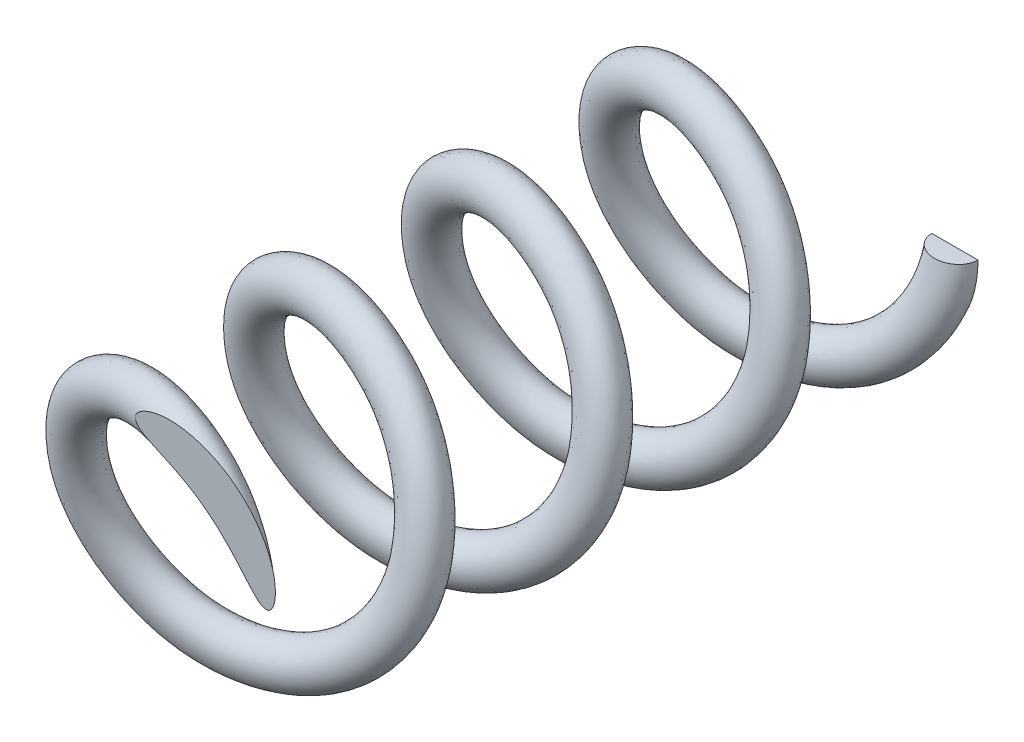
ISO-10303-21;
HEADER;
FILE_DESCRIPTION(('STEP AP214'),'2;1');
FILE_NAME('part.step','',(''),(''),'','','');
FILE_SCHEMA(('AUTOMOTIVE_DESIGN { 1 0 10303 214 1 1 1 1 }'));
ENDSEC;
DATA;
#1=APPLICATION_CONTEXT('core data for automotive mechanical design processes');
#2=APPLICATION_PROTOCOL_DEFINITION('international standard','automotive_design',2000,#1);
#3=PRODUCT_CONTEXT('',#1,'mechanical');
#4=PRODUCT('Part','Part','',(#3));
#5=PRODUCT_RELATED_PRODUCT_CATEGORY('part','',(#4));
#6=PRODUCT_DEFINITION_FORMATION('','',#4);
#7=PRODUCT_DEFINITION_CONTEXT('part definition',#1,'design');
#8=PRODUCT_DEFINITION('design','',#6,#7);
#9=PRODUCT_DEFINITION_SHAPE('','',#8);
#10=(LENGTH_UNIT() NAMED_UNIT(*) SI_UNIT(.MILLI.,.METRE.));
#11=(NAMED_UNIT(*) PLANE_ANGLE_UNIT() SI_UNIT($,.RADIAN.));
#12=(NAMED_UNIT(*) SI_UNIT($,.STERADIAN.) SOLID_ANGLE_UNIT());
#13=UNCERTAINTY_MEASURE_WITH_UNIT(LENGTH_MEASURE(1.E-05),#10,'distance_accuracy_value','');
#14=(GEOMETRIC_REPRESENTATION_CONTEXT(3) GLOBAL_UNCERTAINTY_ASSIGNED_CONTEXT((#13)) GLOBAL_UNIT_ASSIGNED_CONTEXT((#10,
#11,#12)) REPRESENTATION_CONTEXT('',''));
#15=CARTESIAN_POINT('',(0.,0.,0.));
#16=DIRECTION('',(0.,0.,1.));
#17=DIRECTION('',(1.,0.,0.));
#18=AXIS2_PLACEMENT_3D('',#15,#16,#17);
#19=CARTESIAN_POINT('',(2.2,0.,0.814326105627249));
#20=DIRECTION('',(0.,1.,0.));
#21=DIRECTION('',(0.,0.,1.));
#22=AXIS2_PLACEMENT_3D('',#19,#20,#21);
#23=PLANE('',#22);
#24=DIRECTION('',(1.,0.,0.));
#25=VECTOR('',#24,1.);
#26=CARTESIAN_POINT('',(2.2,0.,0.814326105627249));
#27=LINE('',#26,#25);
#28=CARTESIAN_POINT('',(1.8,0.,0.814326105627249));
#29=VERTEX_POINT('',#28);
#30=CARTESIAN_POINT('',(2.6,0.,0.814326105627249));
#31=VERTEX_POINT('',#30);
#32=EDGE_CURVE('E54',#29,#31,#27,.T.);
#33=ORIENTED_EDGE('',*,*,#32,.F.);
#34=CARTESIAN_POINT('',(1.8,0.,0.814326105627249));
#35=CARTESIAN_POINT('',(1.8,0.,1.02052293167192));
#36=CARTESIAN_POINT('',(1.96568542494924,0.,1.16632610562725));
#37=CARTESIAN_POINT('',(2.2,0.,1.16632610562725));
#38=(BOUNDED_CURVE() B_SPLINE_CURVE(3,(#34,#35,#36,#37),.UNSPECIFIED.,.F.,
.F.) B_SPLINE_CURVE_WITH_KNOTS((4,4),(0.,1.),
.UNSPECIFIED.) CURVE() GEOMETRIC_REPRESENTATION_ITEM() RATIONAL_B_SPLINE_CURVE((1.,
0.804737854124365,0.804737854124365,1.)) REPRESENTATION_ITEM(''));
#39=CARTESIAN_POINT('',(2.2,0.,1.16632610562725));
#40=VERTEX_POINT('',#39);
#41=EDGE_CURVE('E59',#29,#40,#38,.T.);
#42=ORIENTED_EDGE('',*,*,#41,.T.);
#43=CARTESIAN_POINT('',(2.2,0.,1.16632610562725));
#44=CARTESIAN_POINT('',(2.43431457505076,0.,1.16632610562725));
#45=CARTESIAN_POINT('',(2.6,0.,1.02052293167192));
#46=CARTESIAN_POINT('',(2.6,0.,0.814326105627249));
#47=(BOUNDED_CURVE() B_SPLINE_CURVE(3,(#43,#44,#45,#46),.UNSPECIFIED.,.F.,
.F.) B_SPLINE_CURVE_WITH_KNOTS((4,4),(0.,1.),
.UNSPECIFIED.) CURVE() GEOMETRIC_REPRESENTATION_ITEM() RATIONAL_B_SPLINE_CURVE((1.,
0.804737854124365,0.804737854124365,1.)) REPRESENTATION_ITEM(''));
#48=EDGE_CURVE('E47',#40,#31,#47,.T.);
#49=ORIENTED_EDGE('',*,*,#48,.T.);
#50=EDGE_LOOP('',(#33,#42,#49));
#51=FACE_BOUND('',#50,.T.);
#52=ADVANCED_FACE('F34',(#51),#23,.T.);
#53=CARTESIAN_POINT('',(2.2,0.,1.16632610562725));
#54=CARTESIAN_POINT('',(2.2,-1.27017059221718,1.42299277229391));
#55=CARTESIAN_POINT('',(1.1,-1.90525588832576,1.67965943896058));
#56=CARTESIAN_POINT('',(0.,-2.54034118443435,1.93632610562725));
#57=CARTESIAN_POINT('',(-1.1,-1.90525588832577,2.19299277229391));
#58=CARTESIAN_POINT('',(-2.2,-1.27017059221718,2.44965943896058));
#59=CARTESIAN_POINT('',(-2.2,0.,2.70632610562725));
#60=CARTESIAN_POINT('',(-2.2,1.27017059221718,2.96299277229391));
#61=CARTESIAN_POINT('',(-1.1,1.90525588832576,3.21965943896058));
#62=CARTESIAN_POINT('',(0.,2.54034118443435,3.47632610562724));
#63=CARTESIAN_POINT('',(1.1,1.90525588832577,3.73299277229391));
#64=CARTESIAN_POINT('',(2.2,1.27017059221718,3.98965943896058));
#65=CARTESIAN_POINT('',(2.2,0.,4.24632610562724));
#66=CARTESIAN_POINT('',(2.2,-1.27017059221718,4.50299277229391));
#67=CARTESIAN_POINT('',(1.1,-1.90525588832576,4.75965943896057));
#68=CARTESIAN_POINT('',(0.,-2.54034118443435,5.01632610562724));
#69=CARTESIAN_POINT('',(-1.1,-1.90525588832577,5.27299277229391));
#70=CARTESIAN_POINT('',(-2.2,-1.27017059221718,5.52965943896057));
#71=CARTESIAN_POINT('',(-2.2,0.,5.78632610562724));
#72=CARTESIAN_POINT('',(-2.2,1.27017059221718,6.04299277229391));
#73=CARTESIAN_POINT('',(-1.1,1.90525588832576,6.29965943896057));
#74=CARTESIAN_POINT('',(0.,2.54034118443435,6.55632610562724));
#75=CARTESIAN_POINT('',(1.1,1.90525588832577,6.8129927722939));
#76=CARTESIAN_POINT('',(2.2,1.27017059221718,7.06965943896057));
#77=CARTESIAN_POINT('',(2.2,0.,7.32632610562724));
#78=CARTESIAN_POINT('',(2.2,-1.27017059221718,7.5829927722939));
#79=CARTESIAN_POINT('',(1.1,-1.90525588832576,7.83965943896057));
#80=CARTESIAN_POINT('',(0.,-2.54034118443435,8.09632610562723));
#81=CARTESIAN_POINT('',(-1.1,-1.90525588832577,8.3529927722939));
#82=CARTESIAN_POINT('',(-2.2,-1.27017059221718,8.60965943896057));
#83=CARTESIAN_POINT('',(-2.2,0.,8.86632610562723));
#84=CARTESIAN_POINT('',(-2.2,1.27017059221718,9.1229927722939));
#85=CARTESIAN_POINT('',(-1.1,1.90525588832576,9.37965943896056));
#86=CARTESIAN_POINT('',(0.,2.54034118443435,9.63632610562723));
#87=CARTESIAN_POINT('',(1.1,1.90525588832577,9.8929927722939));
#88=CARTESIAN_POINT('',(2.2,1.27017059221718,10.1496594389606));
#89=CARTESIAN_POINT('',(2.2,0.,10.4063261056272));
#90=CARTESIAN_POINT('',(2.2,-1.27017059221718,10.6629927722939));
#91=CARTESIAN_POINT('',(1.1,-1.90525588832576,10.9196594389606));
#92=CARTESIAN_POINT('',(0.,-2.54034118443435,11.1763261056272));
#93=CARTESIAN_POINT('',(-1.1,-1.90525588832577,11.4329927722939));
#94=CARTESIAN_POINT('',(-2.2,-1.27017059221718,11.6896594389606));
#95=CARTESIAN_POINT('',(-2.2,0.,11.9463261056272));
#96=CARTESIAN_POINT('',(-2.2,1.27017059221718,12.2029927722939));
#97=CARTESIAN_POINT('',(-1.1,1.90525588832576,12.4596594389606));
#98=CARTESIAN_POINT('',(0.,2.54034118443435,12.7163261056272));
#99=CARTESIAN_POINT('',(1.1,1.90525588832577,12.9729927722939));
#100=CARTESIAN_POINT('',(2.2,1.27017059221718,13.2296594389606));
#101=CARTESIAN_POINT('',(2.2,0.,13.4863261056272));
#102=CARTESIAN_POINT('',(3.,0.,1.16632610562725));
#103=CARTESIAN_POINT('',(3.,-1.73205080756888,1.42299277229392));
#104=CARTESIAN_POINT('',(1.5,-2.59807621135332,1.67965943896058));
#105=CARTESIAN_POINT('',(0.,-3.46410161513775,1.93632610562725));
#106=CARTESIAN_POINT('',(-1.5,-2.59807621135332,2.19299277229391));
#107=CARTESIAN_POINT('',(-3.,-1.73205080756888,2.44965943896058));
#108=CARTESIAN_POINT('',(-3.,0.,2.70632610562725));
#109=CARTESIAN_POINT('',(-3.,1.73205080756888,2.96299277229391));
#110=CARTESIAN_POINT('',(-1.5,2.59807621135332,3.21965943896058));
#111=CARTESIAN_POINT('',(0.,3.46410161513775,3.47632610562724));
#112=CARTESIAN_POINT('',(1.5,2.59807621135332,3.73299277229391));
#113=CARTESIAN_POINT('',(3.,1.73205080756888,3.98965943896058));
#114=CARTESIAN_POINT('',(3.,0.,4.24632610562724));
#115=CARTESIAN_POINT('',(3.,-1.73205080756888,4.50299277229391));
#116=CARTESIAN_POINT('',(1.5,-2.59807621135332,4.75965943896057));
#117=CARTESIAN_POINT('',(0.,-3.46410161513775,5.01632610562724));
#118=CARTESIAN_POINT('',(-1.5,-2.59807621135332,5.27299277229391));
#119=CARTESIAN_POINT('',(-3.,-1.73205080756888,5.52965943896057));
#120=CARTESIAN_POINT('',(-3.,0.,5.78632610562724));
#121=CARTESIAN_POINT('',(-3.,1.73205080756888,6.04299277229391));
#122=CARTESIAN_POINT('',(-1.5,2.59807621135332,6.29965943896057));
#123=CARTESIAN_POINT('',(0.,3.46410161513775,6.55632610562724));
#124=CARTESIAN_POINT('',(1.5,2.59807621135332,6.8129927722939));
#125=CARTESIAN_POINT('',(3.,1.73205080756888,7.06965943896057));
#126=CARTESIAN_POINT('',(3.,0.,7.32632610562724));
#127=CARTESIAN_POINT('',(3.,-1.73205080756888,7.5829927722939));
#128=CARTESIAN_POINT('',(1.5,-2.59807621135332,7.83965943896057));
#129=CARTESIAN_POINT('',(0.,-3.46410161513775,8.09632610562723));
#130=CARTESIAN_POINT('',(-1.5,-2.59807621135332,8.3529927722939));
#131=CARTESIAN_POINT('',(-3.,-1.73205080756888,8.60965943896057));
#132=CARTESIAN_POINT('',(-3.,0.,8.86632610562723));
#133=CARTESIAN_POINT('',(-3.,1.73205080756888,9.1229927722939));
#134=CARTESIAN_POINT('',(-1.5,2.59807621135332,9.37965943896056));
#135=CARTESIAN_POINT('',(0.,3.46410161513775,9.63632610562723));
#136=CARTESIAN_POINT('',(1.5,2.59807621135332,9.8929927722939));
#137=CARTESIAN_POINT('',(3.,1.73205080756888,10.1496594389606));
#138=CARTESIAN_POINT('',(3.,0.,10.4063261056272));
#139=CARTESIAN_POINT('',(3.,-1.73205080756888,10.6629927722939));
#140=CARTESIAN_POINT('',(1.5,-2.59807621135332,10.9196594389606));
#141=CARTESIAN_POINT('',(0.,-3.46410161513775,11.1763261056272));
#142=CARTESIAN_POINT('',(-1.5,-2.59807621135332,11.4329927722939));
#143=CARTESIAN_POINT('',(-3.,-1.73205080756888,11.6896594389606));
#144=CARTESIAN_POINT('',(-3.,0.,11.9463261056272));
#145=CARTESIAN_POINT('',(-3.,1.73205080756888,12.2029927722939));
#146=CARTESIAN_POINT('',(-1.5,2.59807621135332,12.4596594389606));
#147=CARTESIAN_POINT('',(0.,3.46410161513775,12.7163261056272));
#148=CARTESIAN_POINT('',(1.5,2.59807621135332,12.9729927722939));
#149=CARTESIAN_POINT('',(3.,1.73205080756888,13.2296594389606));
#150=CARTESIAN_POINT('',(3.,0.,13.4863261056272));
#151=CARTESIAN_POINT('',(3.,0.,0.462326105627249));
#152=CARTESIAN_POINT('',(3.,-1.73205080756888,0.718992772293915));
#153=CARTESIAN_POINT('',(1.5,-2.59807621135332,0.975659438960581));
#154=CARTESIAN_POINT('',(0.,-3.46410161513775,1.23232610562725));
#155=CARTESIAN_POINT('',(-1.5,-2.59807621135332,1.48899277229391));
#156=CARTESIAN_POINT('',(-3.,-1.73205080756888,1.74565943896058));
#157=CARTESIAN_POINT('',(-3.,0.,2.00232610562725));
#158=CARTESIAN_POINT('',(-3.,1.73205080756888,2.25899277229391));
#159=CARTESIAN_POINT('',(-1.5,2.59807621135332,2.51565943896058));
#160=CARTESIAN_POINT('',(0.,3.46410161513775,2.77232610562724));
#161=CARTESIAN_POINT('',(1.5,2.59807621135332,3.02899277229391));
#162=CARTESIAN_POINT('',(3.,1.73205080756888,3.28565943896058));
#163=CARTESIAN_POINT('',(3.,0.,3.54232610562724));
#164=CARTESIAN_POINT('',(3.,-1.73205080756888,3.79899277229391));
#165=CARTESIAN_POINT('',(1.5,-2.59807621135332,4.05565943896057));
#166=CARTESIAN_POINT('',(0.,-3.46410161513775,4.31232610562724));
#167=CARTESIAN_POINT('',(-1.5,-2.59807621135332,4.56899277229391));
#168=CARTESIAN_POINT('',(-3.,-1.73205080756888,4.82565943896057));
#169=CARTESIAN_POINT('',(-3.,0.,5.08232610562724));
#170=CARTESIAN_POINT('',(-3.,1.73205080756888,5.33899277229391));
#171=CARTESIAN_POINT('',(-1.5,2.59807621135332,5.59565943896057));
#172=CARTESIAN_POINT('',(0.,3.46410161513775,5.85232610562724));
#173=CARTESIAN_POINT('',(1.5,2.59807621135332,6.1089927722939));
#174=CARTESIAN_POINT('',(3.,1.73205080756888,6.36565943896057));
#175=CARTESIAN_POINT('',(3.,0.,6.62232610562724));
#176=CARTESIAN_POINT('',(3.,-1.73205080756888,6.8789927722939));
#177=CARTESIAN_POINT('',(1.5,-2.59807621135332,7.13565943896057));
#178=CARTESIAN_POINT('',(0.,-3.46410161513775,7.39232610562723));
#179=CARTESIAN_POINT('',(-1.5,-2.59807621135332,7.6489927722939));
#180=CARTESIAN_POINT('',(-3.,-1.73205080756888,7.90565943896057));
#181=CARTESIAN_POINT('',(-3.,0.,8.16232610562723));
#182=CARTESIAN_POINT('',(-3.,1.73205080756888,8.4189927722939));
#183=CARTESIAN_POINT('',(-1.5,2.59807621135332,8.67565943896056));
#184=CARTESIAN_POINT('',(0.,3.46410161513775,8.93232610562723));
#185=CARTESIAN_POINT('',(1.5,2.59807621135332,9.1889927722939));
#186=CARTESIAN_POINT('',(3.,1.73205080756888,9.44565943896056));
#187=CARTESIAN_POINT('',(3.,0.,9.70232610562723));
#188=CARTESIAN_POINT('',(3.,-1.73205080756888,9.95899277229389));
#189=CARTESIAN_POINT('',(1.5,-2.59807621135332,10.2156594389606));
#190=CARTESIAN_POINT('',(0.,-3.46410161513775,10.4723261056272));
#191=CARTESIAN_POINT('',(-1.5,-2.59807621135332,10.7289927722939));
#192=CARTESIAN_POINT('',(-3.,-1.73205080756888,10.9856594389606));
#193=CARTESIAN_POINT('',(-3.,0.,11.2423261056272));
#194=CARTESIAN_POINT('',(-3.,1.73205080756888,11.4989927722939));
#195=CARTESIAN_POINT('',(-1.5,2.59807621135332,11.7556594389606));
#196=CARTESIAN_POINT('',(0.,3.46410161513775,12.0123261056272));
#197=CARTESIAN_POINT('',(1.5,2.59807621135332,12.2689927722939));
#198=CARTESIAN_POINT('',(3.,1.73205080756888,12.5256594389606));
#199=CARTESIAN_POINT('',(3.,0.,12.7823261056272));
#200=CARTESIAN_POINT('',(2.2,0.,0.462326105627249));
#201=CARTESIAN_POINT('',(2.2,-1.27017059221718,0.718992772293915));
#202=CARTESIAN_POINT('',(1.1,-1.90525588832576,0.975659438960581));
#203=CARTESIAN_POINT('',(0.,-2.54034118443435,1.23232610562725));
#204=CARTESIAN_POINT('',(-1.1,-1.90525588832577,1.48899277229391));
#205=CARTESIAN_POINT('',(-2.2,-1.27017059221718,1.74565943896058));
#206=CARTESIAN_POINT('',(-2.2,0.,2.00232610562725));
#207=CARTESIAN_POINT('',(-2.2,1.27017059221718,2.25899277229391));
#208=CARTESIAN_POINT('',(-1.1,1.90525588832576,2.51565943896058));
#209=CARTESIAN_POINT('',(0.,2.54034118443435,2.77232610562724));
#210=CARTESIAN_POINT('',(1.1,1.90525588832577,3.02899277229391));
#211=CARTESIAN_POINT('',(2.2,1.27017059221718,3.28565943896058));
#212=CARTESIAN_POINT('',(2.2,0.,3.54232610562724));
#213=CARTESIAN_POINT('',(2.2,-1.27017059221718,3.79899277229391));
#214=CARTESIAN_POINT('',(1.1,-1.90525588832576,4.05565943896057));
#215=CARTESIAN_POINT('',(0.,-2.54034118443435,4.31232610562724));
#216=CARTESIAN_POINT('',(-1.1,-1.90525588832577,4.56899277229391));
#217=CARTESIAN_POINT('',(-2.2,-1.27017059221718,4.82565943896057));
#218=CARTESIAN_POINT('',(-2.2,0.,5.08232610562724));
#219=CARTESIAN_POINT('',(-2.2,1.27017059221718,5.33899277229391));
#220=CARTESIAN_POINT('',(-1.1,1.90525588832576,5.59565943896057));
#221=CARTESIAN_POINT('',(0.,2.54034118443435,5.85232610562724));
#222=CARTESIAN_POINT('',(1.1,1.90525588832577,6.1089927722939));
#223=CARTESIAN_POINT('',(2.2,1.27017059221718,6.36565943896057));
#224=CARTESIAN_POINT('',(2.2,0.,6.62232610562724));
#225=CARTESIAN_POINT('',(2.2,-1.27017059221718,6.8789927722939));
#226=CARTESIAN_POINT('',(1.1,-1.90525588832576,7.13565943896057));
#227=CARTESIAN_POINT('',(0.,-2.54034118443435,7.39232610562723));
#228=CARTESIAN_POINT('',(-1.1,-1.90525588832577,7.6489927722939));
#229=CARTESIAN_POINT('',(-2.2,-1.27017059221718,7.90565943896057));
#230=CARTESIAN_POINT('',(-2.2,0.,8.16232610562723));
#231=CARTESIAN_POINT('',(-2.2,1.27017059221718,8.4189927722939));
#232=CARTESIAN_POINT('',(-1.1,1.90525588832576,8.67565943896057));
#233=CARTESIAN_POINT('',(0.,2.54034118443435,8.93232610562723));
#234=CARTESIAN_POINT('',(1.1,1.90525588832577,9.1889927722939));
#235=CARTESIAN_POINT('',(2.2,1.27017059221718,9.44565943896056));
#236=CARTESIAN_POINT('',(2.2,0.,9.70232610562723));
#237=CARTESIAN_POINT('',(2.2,-1.27017059221718,9.95899277229389));
#238=CARTESIAN_POINT('',(1.1,-1.90525588832576,10.2156594389606));
#239=CARTESIAN_POINT('',(0.,-2.54034118443435,10.4723261056272));
#240=CARTESIAN_POINT('',(-1.1,-1.90525588832577,10.7289927722939));
#241=CARTESIAN_POINT('',(-2.2,-1.27017059221718,10.9856594389606));
#242=CARTESIAN_POINT('',(-2.2,0.,11.2423261056272));
#243=CARTESIAN_POINT('',(-2.2,1.27017059221718,11.4989927722939));
#244=CARTESIAN_POINT('',(-1.1,1.90525588832576,11.7556594389606));
#245=CARTESIAN_POINT('',(0.,2.54034118443435,12.0123261056272));
#246=CARTESIAN_POINT('',(1.1,1.90525588832577,12.2689927722939));
#247=CARTESIAN_POINT('',(2.2,1.27017059221718,12.5256594389606));
#248=CARTESIAN_POINT('',(2.2,0.,12.7823261056272));
#249=CARTESIAN_POINT('',(1.4,0.,0.462326105627249));
#250=CARTESIAN_POINT('',(1.4,-0.808290376865476,0.718992772293915));
#251=CARTESIAN_POINT('',(0.7,-1.21243556529821,0.975659438960581));
#252=CARTESIAN_POINT('',(0.,-1.61658075373095,1.23232610562725));
#253=CARTESIAN_POINT('',(-0.7,-1.21243556529821,1.48899277229391));
#254=CARTESIAN_POINT('',(-1.4,-0.808290376865477,1.74565943896058));
#255=CARTESIAN_POINT('',(-1.4,0.,2.00232610562725));
#256=CARTESIAN_POINT('',(-1.4,0.808290376865476,2.25899277229391));
#257=CARTESIAN_POINT('',(-0.700000000000001,1.21243556529821,2.51565943896058));
#258=CARTESIAN_POINT('',(0.,1.61658075373095,2.77232610562724));
#259=CARTESIAN_POINT('',(0.699999999999999,1.21243556529821,3.02899277229391));
#260=CARTESIAN_POINT('',(1.4,0.808290376865477,3.28565943896058));
#261=CARTESIAN_POINT('',(1.4,0.,3.54232610562724));
#262=CARTESIAN_POINT('',(1.4,-0.808290376865476,3.79899277229391));
#263=CARTESIAN_POINT('',(0.7,-1.21243556529821,4.05565943896057));
#264=CARTESIAN_POINT('',(0.,-1.61658075373095,4.31232610562724));
#265=CARTESIAN_POINT('',(-0.7,-1.21243556529821,4.56899277229391));
#266=CARTESIAN_POINT('',(-1.4,-0.808290376865477,4.82565943896057));
#267=CARTESIAN_POINT('',(-1.4,0.,5.08232610562724));
#268=CARTESIAN_POINT('',(-1.4,0.808290376865476,5.33899277229391));
#269=CARTESIAN_POINT('',(-0.700000000000001,1.21243556529821,5.59565943896057));
#270=CARTESIAN_POINT('',(0.,1.61658075373095,5.85232610562724));
#271=CARTESIAN_POINT('',(0.699999999999999,1.21243556529821,6.1089927722939));
#272=CARTESIAN_POINT('',(1.4,0.808290376865477,6.36565943896057));
#273=CARTESIAN_POINT('',(1.4,0.,6.62232610562724));
#274=CARTESIAN_POINT('',(1.4,-0.808290376865476,6.8789927722939));
#275=CARTESIAN_POINT('',(0.7,-1.21243556529821,7.13565943896057));
#276=CARTESIAN_POINT('',(0.,-1.61658075373095,7.39232610562723));
#277=CARTESIAN_POINT('',(-0.7,-1.21243556529821,7.6489927722939));
#278=CARTESIAN_POINT('',(-1.4,-0.808290376865477,7.90565943896057));
#279=CARTESIAN_POINT('',(-1.4,0.,8.16232610562723));
#280=CARTESIAN_POINT('',(-1.4,0.808290376865476,8.4189927722939));
#281=CARTESIAN_POINT('',(-0.700000000000001,1.21243556529821,8.67565943896056));
#282=CARTESIAN_POINT('',(0.,1.61658075373095,8.93232610562723));
#283=CARTESIAN_POINT('',(0.699999999999999,1.21243556529821,9.1889927722939));
#284=CARTESIAN_POINT('',(1.4,0.808290376865477,9.44565943896056));
#285=CARTESIAN_POINT('',(1.4,0.,9.70232610562723));
#286=CARTESIAN_POINT('',(1.4,-0.808290376865476,9.95899277229389));
#287=CARTESIAN_POINT('',(0.7,-1.21243556529821,10.2156594389606));
#288=CARTESIAN_POINT('',(0.,-1.61658075373095,10.4723261056272));
#289=CARTESIAN_POINT('',(-0.7,-1.21243556529821,10.7289927722939));
#290=CARTESIAN_POINT('',(-1.4,-0.808290376865477,10.9856594389606));
#291=CARTESIAN_POINT('',(-1.4,0.,11.2423261056272));
#292=CARTESIAN_POINT('',(-1.4,0.808290376865476,11.4989927722939));
#293=CARTESIAN_POINT('',(-0.700000000000001,1.21243556529821,11.7556594389606));
#294=CARTESIAN_POINT('',(0.,1.61658075373095,12.0123261056272));
#295=CARTESIAN_POINT('',(0.699999999999999,1.21243556529821,12.2689927722939));
#296=CARTESIAN_POINT('',(1.4,0.808290376865477,12.5256594389606));
#297=CARTESIAN_POINT('',(1.4,0.,12.7823261056272));
#298=CARTESIAN_POINT('',(1.4,0.,1.16632610562725));
#299=CARTESIAN_POINT('',(1.4,-0.808290376865476,1.42299277229392));
#300=CARTESIAN_POINT('',(0.7,-1.21243556529821,1.67965943896058));
#301=CARTESIAN_POINT('',(0.,-1.61658075373095,1.93632610562725));
#302=CARTESIAN_POINT('',(-0.7,-1.21243556529821,2.19299277229391));
#303=CARTESIAN_POINT('',(-1.4,-0.808290376865477,2.44965943896058));
#304=CARTESIAN_POINT('',(-1.4,0.,2.70632610562725));
#305=CARTESIAN_POINT('',(-1.4,0.808290376865476,2.96299277229391));
#306=CARTESIAN_POINT('',(-0.700000000000001,1.21243556529821,3.21965943896058));
#307=CARTESIAN_POINT('',(0.,1.61658075373095,3.47632610562724));
#308=CARTESIAN_POINT('',(0.699999999999999,1.21243556529821,3.73299277229391));
#309=CARTESIAN_POINT('',(1.4,0.808290376865477,3.98965943896058));
#310=CARTESIAN_POINT('',(1.4,0.,4.24632610562724));
#311=CARTESIAN_POINT('',(1.4,-0.808290376865476,4.50299277229391));
#312=CARTESIAN_POINT('',(0.7,-1.21243556529821,4.75965943896057));
#313=CARTESIAN_POINT('',(0.,-1.61658075373095,5.01632610562724));
#314=CARTESIAN_POINT('',(-0.7,-1.21243556529821,5.27299277229391));
#315=CARTESIAN_POINT('',(-1.4,-0.808290376865477,5.52965943896057));
#316=CARTESIAN_POINT('',(-1.4,0.,5.78632610562724));
#317=CARTESIAN_POINT('',(-1.4,0.808290376865476,6.04299277229391));
#318=CARTESIAN_POINT('',(-0.700000000000001,1.21243556529821,6.29965943896057));
#319=CARTESIAN_POINT('',(0.,1.61658075373095,6.55632610562724));
#320=CARTESIAN_POINT('',(0.699999999999999,1.21243556529821,6.8129927722939));
#321=CARTESIAN_POINT('',(1.4,0.808290376865477,7.06965943896057));
#322=CARTESIAN_POINT('',(1.4,0.,7.32632610562724));
#323=CARTESIAN_POINT('',(1.4,-0.808290376865476,7.5829927722939));
#324=CARTESIAN_POINT('',(0.7,-1.21243556529821,7.83965943896057));
#325=CARTESIAN_POINT('',(0.,-1.61658075373095,8.09632610562723));
#326=CARTESIAN_POINT('',(-0.7,-1.21243556529821,8.3529927722939));
#327=CARTESIAN_POINT('',(-1.4,-0.808290376865477,8.60965943896057));
#328=CARTESIAN_POINT('',(-1.4,0.,8.86632610562723));
#329=CARTESIAN_POINT('',(-1.4,0.808290376865476,9.1229927722939));
#330=CARTESIAN_POINT('',(-0.700000000000001,1.21243556529821,9.37965943896056));
#331=CARTESIAN_POINT('',(0.,1.61658075373095,9.63632610562723));
#332=CARTESIAN_POINT('',(0.699999999999999,1.21243556529821,9.8929927722939));
#333=CARTESIAN_POINT('',(1.4,0.808290376865477,10.1496594389606));
#334=CARTESIAN_POINT('',(1.4,0.,10.4063261056272));
#335=CARTESIAN_POINT('',(1.4,-0.808290376865476,10.6629927722939));
#336=CARTESIAN_POINT('',(0.7,-1.21243556529821,10.9196594389606));
#337=CARTESIAN_POINT('',(0.,-1.61658075373095,11.1763261056272));
#338=CARTESIAN_POINT('',(-0.7,-1.21243556529821,11.4329927722939));
#339=CARTESIAN_POINT('',(-1.4,-0.808290376865477,11.6896594389606));
#340=CARTESIAN_POINT('',(-1.4,0.,11.9463261056272));
#341=CARTESIAN_POINT('',(-1.4,0.808290376865476,12.2029927722939));
#342=CARTESIAN_POINT('',(-0.700000000000001,1.21243556529821,12.4596594389606));
#343=CARTESIAN_POINT('',(0.,1.61658075373095,12.7163261056272));
#344=CARTESIAN_POINT('',(0.699999999999999,1.21243556529821,12.9729927722939));
#345=CARTESIAN_POINT('',(1.4,0.808290376865477,13.2296594389606));
#346=CARTESIAN_POINT('',(1.4,0.,13.4863261056272));
#347=CARTESIAN_POINT('',(2.2,0.,1.16632610562725));
#348=CARTESIAN_POINT('',(2.2,-1.27017059221718,1.42299277229391));
#349=CARTESIAN_POINT('',(1.1,-1.90525588832576,1.67965943896058));
#350=CARTESIAN_POINT('',(0.,-2.54034118443435,1.93632610562725));
#351=CARTESIAN_POINT('',(-1.1,-1.90525588832577,2.19299277229391));
#352=CARTESIAN_POINT('',(-2.2,-1.27017059221718,2.44965943896058));
#353=CARTESIAN_POINT('',(-2.2,0.,2.70632610562725));
#354=CARTESIAN_POINT('',(-2.2,1.27017059221718,2.96299277229391));
#355=CARTESIAN_POINT('',(-1.1,1.90525588832576,3.21965943896058));
#356=CARTESIAN_POINT('',(0.,2.54034118443435,3.47632610562724));
#357=CARTESIAN_POINT('',(1.1,1.90525588832577,3.73299277229391));
#358=CARTESIAN_POINT('',(2.2,1.27017059221718,3.98965943896058));
#359=CARTESIAN_POINT('',(2.2,0.,4.24632610562724));
#360=CARTESIAN_POINT('',(2.2,-1.27017059221718,4.50299277229391));
#361=CARTESIAN_POINT('',(1.1,-1.90525588832576,4.75965943896057));
#362=CARTESIAN_POINT('',(0.,-2.54034118443435,5.01632610562724));
#363=CARTESIAN_POINT('',(-1.1,-1.90525588832577,5.27299277229391));
#364=CARTESIAN_POINT('',(-2.2,-1.27017059221718,5.52965943896057));
#365=CARTESIAN_POINT('',(-2.2,0.,5.78632610562724));
#366=CARTESIAN_POINT('',(-2.2,1.27017059221718,6.04299277229391));
#367=CARTESIAN_POINT('',(-1.1,1.90525588832576,6.29965943896057));
#368=CARTESIAN_POINT('',(0.,2.54034118443435,6.55632610562724));
#369=CARTESIAN_POINT('',(1.1,1.90525588832577,6.8129927722939));
#370=CARTESIAN_POINT('',(2.2,1.27017059221718,7.06965943896057));
#371=CARTESIAN_POINT('',(2.2,0.,7.32632610562724));
#372=CARTESIAN_POINT('',(2.2,-1.27017059221718,7.5829927722939));
#373=CARTESIAN_POINT('',(1.1,-1.90525588832576,7.83965943896057));
#374=CARTESIAN_POINT('',(0.,-2.54034118443435,8.09632610562723));
#375=CARTESIAN_POINT('',(-1.1,-1.90525588832577,8.3529927722939));
#376=CARTESIAN_POINT('',(-2.2,-1.27017059221718,8.60965943896057));
#377=CARTESIAN_POINT('',(-2.2,0.,8.86632610562723));
#378=CARTESIAN_POINT('',(-2.2,1.27017059221718,9.1229927722939));
#379=CARTESIAN_POINT('',(-1.1,1.90525588832576,9.37965943896056));
#380=CARTESIAN_POINT('',(0.,2.54034118443435,9.63632610562723));
#381=CARTESIAN_POINT('',(1.1,1.90525588832577,9.8929927722939));
#382=CARTESIAN_POINT('',(2.2,1.27017059221718,10.1496594389606));
#383=CARTESIAN_POINT('',(2.2,0.,10.4063261056272));
#384=CARTESIAN_POINT('',(2.2,-1.27017059221718,10.6629927722939));
#385=CARTESIAN_POINT('',(1.1,-1.90525588832576,10.9196594389606));
#386=CARTESIAN_POINT('',(0.,-2.54034118443435,11.1763261056272));
#387=CARTESIAN_POINT('',(-1.1,-1.90525588832577,11.4329927722939));
#388=CARTESIAN_POINT('',(-2.2,-1.27017059221718,11.6896594389606));
#389=CARTESIAN_POINT('',(-2.2,0.,11.9463261056272));
#390=CARTESIAN_POINT('',(-2.2,1.27017059221718,12.2029927722939));
#391=CARTESIAN_POINT('',(-1.1,1.90525588832576,12.4596594389606));
#392=CARTESIAN_POINT('',(0.,2.54034118443435,12.7163261056272));
#393=CARTESIAN_POINT('',(1.1,1.90525588832577,12.9729927722939));
#394=CARTESIAN_POINT('',(2.2,1.27017059221718,13.2296594389606));
#395=CARTESIAN_POINT('',(2.2,0.,13.4863261056272));
#396=(BOUNDED_SURFACE() B_SPLINE_SURFACE(3,2,((#53,#54,#55,#56,#57,#58,#59,#60,#61,#62,#63,#64,
#65,#66,#67,#68,#69,#70,#71,#72,#73,#74,#75,#76,#77,#78,#79,#80,#81,#82,#83,#84,#85,#86,#87,#88,
#89,#90,#91,#92,#93,#94,#95,#96,#97,#98,#99,#100,#101),(#102,#103,#104,#105,#106,#107,#108,#109,
#110,#111,#112,#113,#114,#115,#116,#117,#118,#119,#120,#121,#122,#123,#124,#125,#126,#127,#128,
#129,#130,#131,#132,#133,#134,#135,#136,#137,#138,#139,#140,#141,#142,#143,#144,#145,#146,#147,
#148,#149,#150),(#151,#152,#153,#154,#155,#156,#157,#158,#159,#160,#161,#162,#163,#164,#165,
#166,#167,#168,#169,#170,#171,#172,#173,#174,#175,#176,#177,#178,#179,#180,#181,#182,#183,#184,
#185,#186,#187,#188,#189,#190,#191,#192,#193,#194,#195,#196,#197,#198,#199),(#200,#201,#202,
#203,#204,#205,#206,#207,#208,#209,#210,#211,#212,#213,#214,#215,#216,#217,#218,#219,#220,#221,
#222,#223,#224,#225,#226,#227,#228,#229,#230,#231,#232,#233,#234,#235,#236,#237,#238,#239,#240,
#241,#242,#243,#244,#245,#246,#247,#248),(#249,#250,#251,#252,#253,#254,#255,#256,#257,#258,
#259,#260,#261,#262,#263,#264,#265,#266,#267,#268,#269,#270,#271,#272,#273,#274,#275,#276,#277,
#278,#279,#280,#281,#282,#283,#284,#285,#286,#287,#288,#289,#290,#291,#292,#293,#294,#295,#296,
#297),(#298,#299,#300,#301,#302,#303,#304,#305,#306,#307,#308,#309,#310,#311,#312,#313,#314,
#315,#316,#317,#318,#319,#320,#321,#322,#323,#324,#325,#326,#327,#328,#329,#330,#331,#332,#333,
#334,#335,#336,#337,#338,#339,#340,#341,#342,#343,#344,#345,#346),(#347,#348,#349,#350,#351,
#352,#353,#354,#355,#356,#357,#358,#359,#360,#361,#362,#363,#364,#365,#366,#367,#368,#369,#370,
#371,#372,#373,#374,#375,#376,#377,#378,#379,#380,#381,#382,#383,#384,#385,#386,#387,#388,#389,
#390,#391,#392,#393,#394,#395)),.UNSPECIFIED.,.T.,.F.,.F.) B_SPLINE_SURFACE_WITH_KNOTS((4,3,4),
(3,2,2,2,2,2,2,2,2,2,2,2,2,2,2,2,2,2,2,2,2,2,2,2,3),(0.,0.5,1.),(0.,0.0416666666666667,
0.0833333333333333,0.125,0.166666666666667,0.208333333333333,0.25,0.291666666666667,
0.333333333333333,0.375,0.416666666666667,0.458333333333333,0.5,0.541666666666667,
0.583333333333333,0.625,0.666666666666667,0.708333333333333,0.75,0.791666666666667,
0.833333333333333,0.875,0.916666666666667,0.958333333333333,1.),
.UNSPECIFIED.) GEOMETRIC_REPRESENTATION_ITEM() RATIONAL_B_SPLINE_SURFACE(((1.,0.866025403784439,
1.,0.866025403784439,1.,0.866025403784439,1.,0.866025403784439,1.,0.866025403784439,1.,
0.866025403784439,1.,0.866025403784439,1.,0.866025403784439,1.,0.866025403784439,1.,
0.866025403784439,1.,0.866025403784439,1.,0.866025403784439,1.,0.866025403784439,1.,
0.866025403784439,1.,0.866025403784439,1.,0.866025403784439,1.,0.866025403784439,1.,
0.866025403784439,1.,0.866025403784439,1.,0.866025403784439,1.,0.866025403784439,1.,
0.866025403784439,1.,0.866025403784439,1.,0.866025403784439,1.),(0.333333333333333,
0.288675134594813,0.333333333333333,0.288675134594813,0.333333333333333,0.288675134594813,
0.333333333333333,0.288675134594813,0.333333333333333,0.288675134594813,0.333333333333333,
0.288675134594813,0.333333333333333,0.288675134594813,0.333333333333333,0.288675134594813,
0.333333333333333,0.288675134594813,0.333333333333333,0.288675134594813,0.333333333333333,
0.288675134594813,0.333333333333333,0.288675134594813,0.333333333333333,0.288675134594813,
0.333333333333333,0.288675134594813,0.333333333333333,0.288675134594813,0.333333333333333,
0.288675134594813,0.333333333333333,0.288675134594813,0.333333333333333,0.288675134594813,
0.333333333333333,0.288675134594813,0.333333333333333,0.288675134594813,0.333333333333333,
0.288675134594813,0.333333333333333,0.288675134594813,0.333333333333333,0.288675134594813,
0.333333333333333,0.288675134594813,0.333333333333333),(0.333333333333333,0.288675134594813,
0.333333333333333,0.288675134594813,0.333333333333333,0.288675134594813,0.333333333333333,
0.288675134594813,0.333333333333333,0.288675134594813,0.333333333333333,0.288675134594813,
0.333333333333333,0.288675134594813,0.333333333333333,0.288675134594813,0.333333333333333,
0.288675134594813,0.333333333333333,0.288675134594813,0.333333333333333,0.288675134594813,
0.333333333333333,0.288675134594813,0.333333333333333,0.288675134594813,0.333333333333333,
0.288675134594813,0.333333333333333,0.288675134594813,0.333333333333333,0.288675134594813,
0.333333333333333,0.288675134594813,0.333333333333333,0.288675134594813,0.333333333333333,
0.288675134594813,0.333333333333333,0.288675134594813,0.333333333333333,0.288675134594813,
0.333333333333333,0.288675134594813,0.333333333333333,0.288675134594813,0.333333333333333,
0.288675134594813,0.333333333333333),(1.,0.866025403784439,1.,0.866025403784439,1.,
0.866025403784439,1.,0.866025403784439,1.,0.866025403784439,1.,0.866025403784439,1.,
0.866025403784439,1.,0.866025403784439,1.,0.866025403784439,1.,0.866025403784439,1.,
0.866025403784439,1.,0.866025403784439,1.,0.866025403784439,1.,0.866025403784439,1.,
0.866025403784439,1.,0.866025403784439,1.,0.866025403784439,1.,0.866025403784439,1.,
0.866025403784439,1.,0.866025403784439,1.,0.866025403784439,1.,0.866025403784439,1.,
0.866025403784439,1.,0.866025403784439,1.),(0.333333333333333,0.288675134594813,
0.333333333333333,0.288675134594813,0.333333333333333,0.288675134594813,0.333333333333333,
0.288675134594813,0.333333333333333,0.288675134594813,0.333333333333333,0.288675134594813,
0.333333333333333,0.288675134594813,0.333333333333333,0.288675134594813,0.333333333333333,
0.288675134594813,0.333333333333333,0.288675134594813,0.333333333333333,0.288675134594813,
0.333333333333333,0.288675134594813,0.333333333333333,0.288675134594813,0.333333333333333,
0.288675134594813,0.333333333333333,0.288675134594813,0.333333333333333,0.288675134594813,
0.333333333333333,0.288675134594813,0.333333333333333,0.288675134594813,0.333333333333333,
0.288675134594813,0.333333333333333,0.288675134594813,0.333333333333333,0.288675134594813,
0.333333333333333,0.288675134594813,0.333333333333333,0.288675134594813,0.333333333333333,
0.288675134594813,0.333333333333333),(0.333333333333333,0.288675134594813,0.333333333333333,
0.288675134594813,0.333333333333333,0.288675134594813,0.333333333333333,0.288675134594813,
0.333333333333333,0.288675134594813,0.333333333333333,0.288675134594813,0.333333333333333,
0.288675134594813,0.333333333333333,0.288675134594813,0.333333333333333,0.288675134594813,
0.333333333333333,0.288675134594813,0.333333333333333,0.288675134594813,0.333333333333333,
0.288675134594813,0.333333333333333,0.288675134594813,0.333333333333333,0.288675134594813,
0.333333333333333,0.288675134594813,0.333333333333333,0.288675134594813,0.333333333333333,
0.288675134594813,0.333333333333333,0.288675134594813,0.333333333333333,0.288675134594813,
0.333333333333333,0.288675134594813,0.333333333333333,0.288675134594813,0.333333333333333,
0.288675134594813,0.333333333333333,0.288675134594813,0.333333333333333,0.288675134594813,
0.333333333333333),(1.,0.866025403784439,1.,0.866025403784439,1.,0.866025403784439,1.,
0.866025403784439,1.,0.866025403784439,1.,0.866025403784439,1.,0.866025403784439,1.,
0.866025403784439,1.,0.866025403784439,1.,0.866025403784439,1.,0.866025403784439,1.,
0.866025403784439,1.,0.866025403784439,1.,0.866025403784439,1.,0.866025403784439,1.,
0.866025403784439,1.,0.866025403784439,1.,0.866025403784439,1.,0.866025403784439,1.,
0.866025403784439,1.,0.866025403784439,1.,0.866025403784439,1.,0.866025403784439,1.,
0.866025403784439,1.))) REPRESENTATION_ITEM('') SURFACE());
#397=CARTESIAN_POINT('',(2.20917520782948,0.489655570835421,12.6844081697047));
#398=CARTESIAN_POINT('',(2.20029119087595,0.480674984968413,12.6844081697047));
#399=CARTESIAN_POINT('',(2.19023171323751,0.472762050924513,12.6844081697047));
#400=CARTESIAN_POINT('',(2.17349672452654,0.463809974482963,12.6844081697047));
#401=CARTESIAN_POINT('',(2.16760530856216,0.461306349533446,12.6844081697047));
#402=CARTESIAN_POINT('',(2.15545664880238,0.457457494024574,12.6844081697047));
#403=CARTESIAN_POINT('',(2.14919955048543,0.456111806111374,12.6844081697047));
#404=CARTESIAN_POINT('',(2.1314702088447,0.454020755728229,12.6844081697047));
#405=CARTESIAN_POINT('',(2.11983281612845,0.454618284704843,12.6844081697047));
#406=CARTESIAN_POINT('',(2.0993425018065,0.458340425002992,12.6844081697047));
#407=CARTESIAN_POINT('',(2.09037732684256,0.460968972481448,12.6844081697047));
#408=CARTESIAN_POINT('',(2.07291892826003,0.467528567162888,12.6844081697047));
#409=CARTESIAN_POINT('',(2.06442734690874,0.47146385299686,12.6844081697047));
#410=CARTESIAN_POINT('',(2.04476183006305,0.48188660914423,12.6844081697047));
#411=CARTESIAN_POINT('',(2.03380626412944,0.488774292129501,12.6844081697047));
#412=CARTESIAN_POINT('',(2.01258889015248,0.503559129164081,12.6844081697047));
#413=CARTESIAN_POINT('',(2.00232869559722,0.511458515796133,12.6844081697047));
#414=CARTESIAN_POINT('',(1.98227059975685,0.527953711006842,12.6844081697047));
#415=CARTESIAN_POINT('',(1.97247642592863,0.536553996493855,12.6844081697047));
#416=CARTESIAN_POINT('',(1.9532993488508,0.554174943459267,12.6844081697047));
#417=CARTESIAN_POINT('',(1.94391598724794,0.563195112005061,12.6844081697047));
#418=CARTESIAN_POINT('',(1.91398885630946,0.592876486682185,12.6844081697047));
#419=CARTESIAN_POINT('',(1.89402155107098,0.614114230299198,12.6844081697047));
#420=CARTESIAN_POINT('',(1.85477442495476,0.657218655367329,12.6844081697047));
#421=CARTESIAN_POINT('',(1.83549500509755,0.679085690683143,12.6844081697047));
#422=CARTESIAN_POINT('',(1.79719902120452,0.723098566686961,12.6844081697047));
#423=CARTESIAN_POINT('',(1.7781828271363,0.745244729791236,12.6844081697047));
#424=CARTESIAN_POINT('',(1.74018278787452,0.78956478953489,12.6844081697047));
#425=CARTESIAN_POINT('',(1.72119894381665,0.811738687102394,12.6844081697047));
#426=CARTESIAN_POINT('',(1.66420743675754,0.877875620838369,12.6844081697047));
#427=CARTESIAN_POINT('',(1.62598723181077,0.921659430150172,12.6844081697047));
#428=CARTESIAN_POINT('',(1.5482231883606,1.00801793804008,12.6844081697047));
#429=CARTESIAN_POINT('',(1.50867970389474,1.05059295447899,12.6844081697047));
#430=CARTESIAN_POINT('',(1.4041910853551,1.15854487218422,12.6844081697047));
#431=CARTESIAN_POINT('',(1.3379297715148,1.22267638176232,12.6844081697047));
#432=CARTESIAN_POINT('',(1.23478475154956,1.31462857193839,12.6844081697047));
#433=CARTESIAN_POINT('',(1.19978054302876,1.3445695470611,12.6844081697047));
#434=CARTESIAN_POINT('',(1.12848900390271,1.40288318370657,12.6844081697047));
#435=CARTESIAN_POINT('',(1.09220176385894,1.43125595555847,12.6844081697047));
#436=CARTESIAN_POINT('',(1.01818885788505,1.48638123460443,12.6844081697046));
#437=CARTESIAN_POINT('',(0.980458062145149,1.51312687631534,12.6844081697046));
#438=CARTESIAN_POINT('',(0.903703425040027,1.56468970699798,12.6844081697047));
#439=CARTESIAN_POINT('',(0.864679544545317,1.58950683753569,12.684408169705));
#440=CARTESIAN_POINT('',(0.746100309380213,1.66138178311899,12.684408169704));
#441=CARTESIAN_POINT('',(0.664997540890204,1.70589223208572,12.6844081697013));
#442=CARTESIAN_POINT('',(0.547568927502925,1.76573622843179,12.684408169703));
#443=CARTESIAN_POINT('',(0.512262194153687,1.78315235141869,12.6844081697042));
#444=CARTESIAN_POINT('',(0.441296301427887,1.81732543897213,12.6844081697051));
#445=CARTESIAN_POINT('',(0.405636897610914,1.83408189941693,12.6844081697048));
#446=CARTESIAN_POINT('',(0.334037703678328,1.86730454582652,12.6844081697045));
#447=CARTESIAN_POINT('',(0.298097371233937,1.88376953749783,12.6844081697046));
#448=CARTESIAN_POINT('',(0.226711919685795,1.91666999672491,12.6844081697047));
#449=CARTESIAN_POINT('',(0.191265952616601,1.93310352902323,12.6844081697047));
#450=CARTESIAN_POINT('',(0.138525706801545,1.95852140752433,12.6844081697047));
#451=CARTESIAN_POINT('',(0.121041894941153,1.96710907418507,12.6844081697047));
#452=CARTESIAN_POINT('',(0.0863028666031981,1.98473261788865,12.6844081697047));
#453=CARTESIAN_POINT('',(0.0690476042719865,1.99376840324566,12.6844081697047));
#454=CARTESIAN_POINT('',(0.0350140283247382,2.01250290815034,12.6844081697047));
#455=CARTESIAN_POINT('',(0.018233719047719,2.02219798143966,12.6844081697047));
#456=CARTESIAN_POINT('',(-0.014639175578379,2.0426840423225,12.6844081697047));
#457=CARTESIAN_POINT('',(-0.0307327708706717,2.05347333576554,12.6844081697047));
#458=CARTESIAN_POINT('',(-0.0501229610695375,2.06813806434626,12.6844081697047));
#459=CARTESIAN_POINT('',(-0.0540397816416236,2.07119141329859,12.6844081697047));
#460=CARTESIAN_POINT('',(-0.0617662362168783,2.07743300236346,12.6844081697047));
#461=CARTESIAN_POINT('',(-0.0655758346512082,2.08062128638001,12.6844081697047));
#462=CARTESIAN_POINT('',(-0.0768223661145975,2.09042273484821,12.6844081697047));
#463=CARTESIAN_POINT('',(-0.0840657025379627,2.09726411299706,12.6844081697047));
#464=CARTESIAN_POINT('',(-0.097835991228126,2.11178404533166,12.6844081697047));
#465=CARTESIAN_POINT('',(-0.104354641188301,2.11947062098151,12.6844081697047));
#466=CARTESIAN_POINT('',(-0.116112475728465,2.1357775996261,12.6844081697046));
#467=CARTESIAN_POINT('',(-0.1213553438064,2.14439520790964,12.6844081697046));
#468=CARTESIAN_POINT('',(-0.128314216507457,2.15925250481608,12.6844081697046));
#469=CARTESIAN_POINT('',(-0.130619124522069,2.16521309068131,12.6844081697047));
#470=CARTESIAN_POINT('',(-0.134230505979728,2.17742801232023,12.6844081697047));
#471=CARTESIAN_POINT('',(-0.135538543758363,2.18368187143415,12.6844081697047));
#472=CARTESIAN_POINT('',(-0.137019668787325,2.1963622568421,12.6844081697047));
#473=CARTESIAN_POINT('',(-0.137186345095977,2.20278955521784,12.6844081697047));
#474=CARTESIAN_POINT('',(-0.136357357871748,2.21556903644792,12.6844081697047));
#475=CARTESIAN_POINT('',(-0.13536076410004,2.22192115507723,12.6844081697047));
#476=CARTESIAN_POINT('',(-0.130324580522976,2.24247077889647,12.6844081697047));
#477=CARTESIAN_POINT('',(-0.124012532173604,2.25611663616187,12.6844081697047));
#478=CARTESIAN_POINT('',(-0.109897861154156,2.27840054825011,12.6844081697047));
#479=CARTESIAN_POINT('',(-0.102712910794167,2.28748337101788,12.6844081697047));
#480=CARTESIAN_POINT('',(-0.0870779392444598,2.30452174406902,12.6844081697047));
#481=CARTESIAN_POINT('',(-0.0786245433024077,2.31247417352812,12.6844081697046));
#482=CARTESIAN_POINT('',(-0.052673360878977,2.33434000952096,12.6844081697047));
#483=CARTESIAN_POINT('',(-0.0340742176924023,2.34692094034668,12.684408169705));
#484=CARTESIAN_POINT('',(0.00462990240027395,2.36945724237934,12.6844081697043));
#485=CARTESIAN_POINT('',(0.0247388396591186,2.37940537497888,12.6844081697032));
#486=CARTESIAN_POINT('',(0.0666295906455104,2.3975642749251,12.6844081697031));
#487=CARTESIAN_POINT('',(0.0884459437732216,2.40569452874019,12.6844081697042));
#488=CARTESIAN_POINT('',(0.13268554780894,2.42011203704112,12.6844081697051));
#489=CARTESIAN_POINT('',(0.155109358135566,2.42639752494096,12.6844081697048));
#490=CARTESIAN_POINT('',(0.223004561164629,2.44288483041917,12.6844081697044));
#491=CARTESIAN_POINT('',(0.26906192944381,2.45070249236118,12.6844081697046));
#492=CARTESIAN_POINT('',(0.355495839331334,2.46045868768296,12.6844081697047));
#493=CARTESIAN_POINT('',(0.395808160827007,2.46304376520851,12.6844081697047));
#494=CARTESIAN_POINT('',(0.476526274103645,2.46476153856719,12.6844081697047));
#495=CARTESIAN_POINT('',(0.516932109144828,2.46389202784343,12.6844081697047));
#496=CARTESIAN_POINT('',(0.63788123142367,2.45657248656513,12.6844081697047));
#497=CARTESIAN_POINT('',(0.718153075217847,2.44541115787021,12.6844081697046));
#498=CARTESIAN_POINT('',(0.901425237051761,2.40691362136388,12.6844081697045));
#499=CARTESIAN_POINT('',(1.00358741185287,2.37557914244966,12.6844081697046));
#500=CARTESIAN_POINT('',(1.15179543330236,2.31641365366065,12.6844081697047));
#501=CARTESIAN_POINT('',(1.20038193045751,2.2946506015082,12.6844081697047));
#502=CARTESIAN_POINT('',(1.2957324092149,2.24733059872497,12.6844081697047));
#503=CARTESIAN_POINT('',(1.34249453653968,2.22176990883686,12.6844081697047));
#504=CARTESIAN_POINT('',(1.48099324484268,2.13902322198633,12.6844081697047));
#505=CARTESIAN_POINT('',(1.56952693771815,2.0763463740169,12.6844081697047));
#506=CARTESIAN_POINT('',(1.73538143715167,1.93759568704201,12.6844081697047));
#507=CARTESIAN_POINT('',(1.81270729487285,1.86152791752188,12.6844081697046));
#508=CARTESIAN_POINT('',(1.92016459934176,1.73645451850867,12.6844081697047));
#509=CARTESIAN_POINT('',(1.9553060257932,1.69168943164283,12.6844081697047));
#510=CARTESIAN_POINT('',(2.02133604283488,1.59918294770785,12.6844081697046));
#511=CARTESIAN_POINT('',(2.0522267635793,1.55144305895477,12.6844081697045));
#512=CARTESIAN_POINT('',(2.13779430709538,1.40429298373498,12.6844081697049));
#513=CARTESIAN_POINT('',(2.18563228048157,1.30064655024549,12.684408169706));
#514=CARTESIAN_POINT('',(2.23912441594639,1.14127337594069,12.6844081697053));
#515=CARTESIAN_POINT('',(2.25380482818987,1.08844483502874,12.6844081697046));
#516=CARTESIAN_POINT('',(2.27678656592497,0.98135662635026,12.6844081697047));
#517=CARTESIAN_POINT('',(2.28509178363677,0.927097852742743,12.6844081697054));
#518=CARTESIAN_POINT('',(2.29213780853411,0.837506956654211,12.6844081697047));
#519=CARTESIAN_POINT('',(2.29323862746407,0.802355223066127,12.684408169704));
#520=CARTESIAN_POINT('',(2.29132773432603,0.73218398604673,12.6844081697054));
#521=CARTESIAN_POINT('',(2.28832788522413,0.697164393835858,12.6844081697075));
#522=CARTESIAN_POINT('',(2.27948367104446,0.645180719654778,12.6844081697062));
#523=CARTESIAN_POINT('',(2.27578063867833,0.627854864152848,12.684408169705));
#524=CARTESIAN_POINT('',(2.26646921185017,0.593645146567531,12.6844081697043));
#525=CARTESIAN_POINT('',(2.26085619052141,0.576762466051756,12.6844081697047));
#526=CARTESIAN_POINT('',(2.24846552851154,0.547442347960538,12.6844081697049));
#527=CARTESIAN_POINT('',(2.24216894771288,0.534807765791983,12.6844081697047));
#528=CARTESIAN_POINT('',(2.22744503336262,0.510902014612806,12.6844081697046));
#529=CARTESIAN_POINT('',(2.2190338838794,0.499621410304705,12.6844081697047));
#530=CARTESIAN_POINT('',(2.20917520782948,0.489655570835421,12.6844081697047));
#531=B_SPLINE_CURVE_WITH_KNOTS('',3,(#397,#398,#399,#400,#401,#402,#403,#404,#405,#406,#407,
#408,#409,#410,#411,#412,#413,#414,#415,#416,#417,#418,#419,#420,#421,#422,#423,#424,#425,#426,
#427,#428,#429,#430,#431,#432,#433,#434,#435,#436,#437,#438,#439,#440,#441,#442,#443,#444,#445,
#446,#447,#448,#449,#450,#451,#452,#453,#454,#455,#456,#457,#458,#459,#460,#461,#462,#463,#464,
#465,#466,#467,#468,#469,#470,#471,#472,#473,#474,#475,#476,#477,#478,#479,#480,#481,#482,#483,
#484,#485,#486,#487,#488,#489,#490,#491,#492,#493,#494,#495,#496,#497,#498,#499,#500,#501,#502,
#503,#504,#505,#506,#507,#508,#509,#510,#511,#512,#513,#514,#515,#516,#517,#518,#519,#520,#521,
#522,#523,#524,#525,#526,#527,#528,#529,#530),.UNSPECIFIED.,.T.,.F.,(4,2,2,2,2,2,2,2,2,2,2,2,2,
2,2,2,2,2,2,2,2,2,2,2,2,2,2,2,2,2,2,2,2,2,2,2,2,2,2,2,2,2,2,2,2,2,2,2,2,2,2,2,2,2,2,2,2,2,2,2,2,
2,2,2,2,2,4),(0.,0.0377491172988048,0.0568449891751417,0.0759333152314108,0.11030194176604,
0.138211098799167,0.16621168301535,0.204937147494254,0.243749591573093,0.282832995806933,
0.321871620510361,0.409277854410893,0.496734238049472,0.584303104813835,0.671874984940865,
0.846213600737535,1.02050594018079,1.29685123240303,1.43500160699679,1.57314224977609,
1.71183025179504,1.85052245443241,2.12775948761465,2.24586447187944,2.36405802736099,
2.48265742825027,2.59986031373485,2.65829404870117,2.71671587695919,2.77483741278501,
2.83287029601769,2.8477665258879,2.86266764039915,2.89251205919855,2.92266921526735,
2.9527382385974,2.97184004522239,2.99091181432008,3.01009062087574,3.02928477477033,
3.07346575272242,3.10809093415287,3.14280992659477,3.20981022105313,3.27699285595364,
3.34673189387052,3.41653749904621,3.55626952189353,3.67731012370244,3.79842805047181,
4.04067301704807,4.35950816835228,4.5190853888409,4.67882078766781,5.00282396414519,
5.32668066131808,5.49719192635021,5.66761742951906,6.00726948818506,6.17149855809873,
6.33562728201918,6.44098055701935,6.5460296959939,6.59911096596352,6.65232174943904,
6.69452596688579,6.73641651263393),.UNSPECIFIED.);
#532=CARTESIAN_POINT('',(2.20917520782948,0.489655570835421,12.6844081697047));
#533=VERTEX_POINT('',#532);
#534=EDGE_CURVE('E63',#533,#533,#531,.T.);
#535=CARTESIAN_POINT('',(1.8,0.,0.814326105627249));
#536=CARTESIAN_POINT('',(1.8000008609538,-0.0329837314374895,0.814326105627249));
#537=CARTESIAN_POINT('',(1.79941484465005,-0.0659650292232788,0.814326105627249));
#538=CARTESIAN_POINT('',(1.79713610350774,-0.131890975165079,0.814326105627249));
#539=CARTESIAN_POINT('',(1.79544333726287,-0.164835621903688,0.814326105627249));
#540=CARTESIAN_POINT('',(1.79101777883446,-0.2306595635196,0.814326105627249));
#541=CARTESIAN_POINT('',(1.78828481120234,-0.263538846431186,0.814326105627249));
#542=CARTESIAN_POINT('',(1.78187072901824,-0.329025857990569,0.814326105627249));
#543=CARTESIAN_POINT('',(1.77819478484328,-0.361634096746689,0.814326105627249));
#544=CARTESIAN_POINT('',(1.76997024440427,-0.426729364989957,0.814326105627249));
#545=CARTESIAN_POINT('',(1.76542191742264,-0.459216428734341,0.814326105627247));
#546=CARTESIAN_POINT('',(1.75554939802157,-0.524041686418384,0.81432610562725));
#547=CARTESIAN_POINT('',(1.75022590765965,-0.556379988037238,0.814326105627254));
#548=CARTESIAN_POINT('',(1.73769367178535,-0.627871538951408,0.814326105627255));
#549=CARTESIAN_POINT('',(1.73032558753534,-0.666996698277569,0.81432610562725));
#550=CARTESIAN_POINT('',(1.71484155629603,-0.745139069898179,0.814326105627247));
#551=CARTESIAN_POINT('',(1.70672483908221,-0.784156127502259,0.814326105627248));
#552=CARTESIAN_POINT('',(1.69007383899128,-0.8622601340268,0.814326105627249));
#553=CARTESIAN_POINT('',(1.68153803245143,-0.90134674963399,0.814326105627249));
#554=CARTESIAN_POINT('',(1.6646730005364,-0.979339486394646,0.814326105627249));
#555=CARTESIAN_POINT('',(1.65634288831219,-1.01824539791942,0.814326105627249));
#556=CARTESIAN_POINT('',(1.64474385085576,-1.07671835011271,0.814326105627249));
#557=CARTESIAN_POINT('',(1.64103227558278,-1.09619596280141,0.814326105627249));
#558=CARTESIAN_POINT('',(1.63412644027363,-1.13524147682529,0.814326105627249));
#559=CARTESIAN_POINT('',(1.63093206500598,-1.15480935704699,0.814326105627249));
#560=CARTESIAN_POINT('',(1.62541163814654,-1.19394875886867,0.814326105627249));
#561=CARTESIAN_POINT('',(1.62308045371335,-1.21351954324623,0.814326105627249));
#562=CARTESIAN_POINT('',(1.61980725434261,-1.25277128806046,0.814326105627249));
#563=CARTESIAN_POINT('',(1.61886274475848,-1.27245198654917,0.814326105627249));
#564=CARTESIAN_POINT('',(1.61924582499185,-1.29969924415697,0.814326105627249));
#565=CARTESIAN_POINT('',(1.61953372879962,-1.30727681493245,0.814326105627249));
#566=CARTESIAN_POINT('',(1.6205757318449,-1.32240445905089,0.814326105627249));
#567=CARTESIAN_POINT('',(1.62133001497536,-1.32995452036511,0.814326105627249));
#568=CARTESIAN_POINT('',(1.62342259001883,-1.34490662805651,0.814326105627249));
#569=CARTESIAN_POINT('',(1.62475520618267,-1.35230939956216,0.814326105627249));
#570=CARTESIAN_POINT('',(1.6281533271373,-1.36694115276181,0.814326105627249));
#571=CARTESIAN_POINT('',(1.63021910832665,-1.37417006781409,0.814326105627249));
#572=CARTESIAN_POINT('',(1.63727571694094,-1.39381085594216,0.814326105627249));
#573=CARTESIAN_POINT('',(1.64329385257558,-1.40592352207042,0.814326105627249));
#574=CARTESIAN_POINT('',(1.65518318106952,-1.4221010003349,0.814326105627249));
#575=CARTESIAN_POINT('',(1.65966290940269,-1.42718862134058,0.814326105627249));
#576=CARTESIAN_POINT('',(1.66951929112653,-1.43640237574548,0.814326105627249));
#577=CARTESIAN_POINT('',(1.67489475706567,-1.44052976496265,0.814326105627249));
#578=CARTESIAN_POINT('',(1.68569985898162,-1.44727612992921,0.814326105627249));
#579=CARTESIAN_POINT('',(1.69105792400802,-1.45001136460183,0.814326105627249));
#580=CARTESIAN_POINT('',(1.7021420715399,-1.45461189399635,0.814326105627249));
#581=CARTESIAN_POINT('',(1.70786888441552,-1.45647539778899,0.814326105627248));
#582=CARTESIAN_POINT('',(1.73079926681835,-1.46224504419231,0.81432610562725));
#583=CARTESIAN_POINT('',(1.74875119726004,-1.46311824553856,0.814326105627259));
#584=CARTESIAN_POINT('',(1.78200490959478,-1.46082480561656,0.81432610562724));
#585=CARTESIAN_POINT('',(1.79737078834642,-1.45811943209286,0.814326105627217));
#586=CARTESIAN_POINT('',(1.82761836880492,-1.45059443704303,0.814326105627281));
#587=CARTESIAN_POINT('',(1.8424986179278,-1.44576900373702,0.814326105627368));
#588=CARTESIAN_POINT('',(1.87218446709892,-1.43442006176431,0.814326105627372));
#589=CARTESIAN_POINT('',(1.88696832756072,-1.42784195118174,0.814326105627282));
#590=CARTESIAN_POINT('',(1.91594399211327,-1.41347922799511,0.814326105627215));
#591=CARTESIAN_POINT('',(1.9301353052982,-1.40569363925593,0.814326105627239));
#592=CARTESIAN_POINT('',(1.97190200974774,-1.38089755421501,0.81432610562727));
#593=CARTESIAN_POINT('',(1.99863253930879,-1.36246367102235,0.81432610562724));
#594=CARTESIAN_POINT('',(2.04958142933186,-1.32333416236824,0.814326105627258));
#595=CARTESIAN_POINT('',(2.07383579754656,-1.30268419018454,0.814326105627304));
#596=CARTESIAN_POINT('',(2.12053016475305,-1.25940139936586,0.814326105627194));
#597=CARTESIAN_POINT('',(2.14296863985034,-1.23676694787112,0.814326105627038));
#598=CARTESIAN_POINT('',(2.20770339941686,-1.16645112667047,0.814326105627671));
#599=CARTESIAN_POINT('',(2.24740204421562,-1.11637101168644,0.814326105629565));
#600=CARTESIAN_POINT('',(2.33787274303361,-0.986358276096308,0.814326105630683));
#601=CARTESIAN_POINT('',(2.3847118646545,-0.903703720917691,0.814326105628174));
#602=CARTESIAN_POINT('',(2.46453351338677,-0.731909921441675,0.814326105626323));
#603=CARTESIAN_POINT('',(2.49749269844765,-0.642760046814835,0.814326105626986));
#604=CARTESIAN_POINT('',(2.54938629441674,-0.461931949930009,0.814326105627508));
#605=CARTESIAN_POINT('',(2.56851914401614,-0.370309921032743,0.814326105627378));
#606=CARTESIAN_POINT('',(2.59380151025565,-0.185756946892323,0.81432610562712));
#607=CARTESIAN_POINT('',(2.6000170100305,-0.0928351068793265,0.814326105626992));
#608=CARTESIAN_POINT('',(2.6,0.,0.814326105627249));
#609=B_SPLINE_CURVE_WITH_KNOTS('',3,(#535,#536,#537,#538,#539,#540,#541,#542,#543,#544,#545,
#546,#547,#548,#549,#550,#551,#552,#553,#554,#555,#556,#557,#558,#559,#560,#561,#562,#563,#564,
#565,#566,#567,#568,#569,#570,#571,#572,#573,#574,#575,#576,#577,#578,#579,#580,#581,#582,#583,
#584,#585,#586,#587,#588,#589,#590,#591,#592,#593,#594,#595,#596,#597,#598,#599,#600,#601,#602,
#603,#604,#605,#606,#607,#608),.UNSPECIFIED.,.F.,.F.,(4,2,2,2,2,2,2,2,2,2,2,2,2,2,2,2,2,2,2,2,2,
2,2,2,2,2,2,2,2,2,2,2,2,2,2,2,4),(0.,0.0989424152180384,0.197888532333062,0.29685134588343,
0.395282727328278,0.493683774258878,0.591996248388533,0.711424610212599,0.830977245452322,
0.951002424624496,1.07035797068338,1.12983884349309,1.189306445752,1.24841452666896,
1.30741614050149,1.33015396548168,1.35290076168806,1.37542919814856,1.39796613672403,
1.43787188789697,1.45809579284874,1.47829309783235,1.49625942386901,1.51426250048804,
1.56712962047264,1.61380357646269,1.66060628729179,1.7090843720636,1.75760185317731,
1.85475824282235,1.95020012384939,2.04572128643746,2.236828377452,2.52038109746868,
2.80440878532223,3.08427439023229,3.36270686381195),.UNSPECIFIED.);
#610=EDGE_CURVE('E11',#29,#31,#609,.T.);
#611=ORIENTED_EDGE('',*,*,#534,.T.);
#612=EDGE_LOOP('',(#611));
#613=FACE_BOUND('',#612,.T.);
#614=ORIENTED_EDGE('',*,*,#41,.F.);
#615=ORIENTED_EDGE('',*,*,#610,.T.);
#616=ORIENTED_EDGE('',*,*,#48,.F.);
#617=EDGE_LOOP('',(#614,#615,#616));
#618=FACE_BOUND('',#617,.T.);
#619=ADVANCED_FACE('F65',(#613,#618),#396,.F.);
#620=CARTESIAN_POINT('',(-2.34950000000111,-3.00222139978605,0.814326105627249));
#621=DIRECTION('',(0.,0.,1.));
#622=DIRECTION('',(1.,0.,0.));
#623=AXIS2_PLACEMENT_3D('',#620,#621,#622);
#624=PLANE('',#623);
#625=ORIENTED_EDGE('',*,*,#32,.T.);
#626=ORIENTED_EDGE('',*,*,#610,.F.);
#627=EDGE_LOOP('',(#625,#626));
#628=FACE_BOUND('',#627,.T.);
#629=ADVANCED_FACE('F61',(#628),#624,.F.);
#630=CARTESIAN_POINT('',(-2.34950000000111,-3.00222139978605,12.6844081697047));
#631=DIRECTION('',(0.,0.,-1.));
#632=DIRECTION('',(-1.,0.,0.));
#633=AXIS2_PLACEMENT_3D('',#630,#631,#632);
#634=PLANE('',#633);
#635=ORIENTED_EDGE('',*,*,#534,.F.);
#636=EDGE_LOOP('',(#635));
#637=FACE_BOUND('',#636,.T.);
#638=ADVANCED_FACE('F86',(#637),#634,.F.);
#639=CLOSED_SHELL('',(#52,#619,#629,#638));
#640=MANIFOLD_SOLID_BREP('B2',#639);
#641=ADVANCED_BREP_SHAPE_REPRESENTATION('',(#18,#640),#14);
#642=SHAPE_DEFINITION_REPRESENTATION(#9,#641);
ENDSEC;
END-ISO-10303-21;
